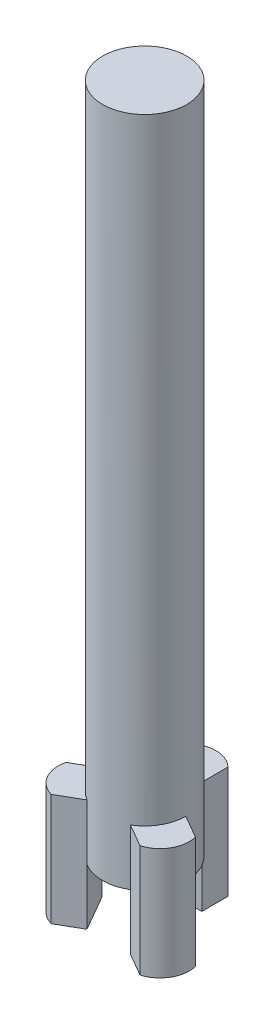
ISO-10303-21;
HEADER;
FILE_DESCRIPTION(('STEP AP214'),'2;1');
FILE_NAME('part.step','',(''),(''),'','','');
FILE_SCHEMA(('AUTOMOTIVE_DESIGN { 1 0 10303 214 1 1 1 1 }'));
ENDSEC;
DATA;
#1=APPLICATION_CONTEXT('core data for automotive mechanical design processes');
#2=APPLICATION_PROTOCOL_DEFINITION('international standard','automotive_design',2000,#1);
#3=PRODUCT_CONTEXT('',#1,'mechanical');
#4=PRODUCT('Part','Part','',(#3));
#5=PRODUCT_RELATED_PRODUCT_CATEGORY('part','',(#4));
#6=PRODUCT_DEFINITION_FORMATION('','',#4);
#7=PRODUCT_DEFINITION_CONTEXT('part definition',#1,'design');
#8=PRODUCT_DEFINITION('design','',#6,#7);
#9=PRODUCT_DEFINITION_SHAPE('','',#8);
#10=(LENGTH_UNIT() NAMED_UNIT(*) SI_UNIT(.MILLI.,.METRE.));
#11=(NAMED_UNIT(*) PLANE_ANGLE_UNIT() SI_UNIT($,.RADIAN.));
#12=(NAMED_UNIT(*) SI_UNIT($,.STERADIAN.) SOLID_ANGLE_UNIT());
#13=UNCERTAINTY_MEASURE_WITH_UNIT(LENGTH_MEASURE(1.E-05),#10,'distance_accuracy_value','');
#14=(GEOMETRIC_REPRESENTATION_CONTEXT(3) GLOBAL_UNCERTAINTY_ASSIGNED_CONTEXT((#13)) GLOBAL_UNIT_ASSIGNED_CONTEXT((#10,
#11,#12)) REPRESENTATION_CONTEXT('',''));
#15=CARTESIAN_POINT('',(0.,0.,0.));
#16=DIRECTION('',(0.,0.,1.));
#17=DIRECTION('',(1.,0.,0.));
#18=AXIS2_PLACEMENT_3D('',#15,#16,#17);
#19=CARTESIAN_POINT('',(0.,130.,0.));
#20=DIRECTION('',(0.,-1.,0.));
#21=DIRECTION('',(0.,0.,-1.));
#22=AXIS2_PLACEMENT_3D('',#19,#20,#21);
#23=CYLINDRICAL_SURFACE('',#22,7.5);
#24=CARTESIAN_POINT('',(0.,130.,0.));
#25=DIRECTION('',(0.,1.,0.));
#26=DIRECTION('',(0.,0.,1.));
#27=AXIS2_PLACEMENT_3D('',#24,#25,#26);
#28=CIRCLE('',#27,7.5);
#29=CARTESIAN_POINT('',(0.,130.,7.5));
#30=VERTEX_POINT('',#29);
#31=EDGE_CURVE('E243',#30,#30,#28,.T.);
#32=ORIENTED_EDGE('',*,*,#31,.F.);
#33=EDGE_LOOP('',(#32));
#34=FACE_BOUND('',#33,.T.);
#35=CARTESIAN_POINT('',(0.,20.,0.));
#36=DIRECTION('',(0.,1.,0.));
#37=DIRECTION('',(0.,0.,1.));
#38=AXIS2_PLACEMENT_3D('',#35,#36,#37);
#39=CIRCLE('',#38,7.5);
#40=CARTESIAN_POINT('',(3.87664123035197,20.,6.42040908129187));
#41=VERTEX_POINT('',#40);
#42=CARTESIAN_POINT('',(7.49855798226306,20.,0.147065246196892));
#43=VERTEX_POINT('',#42);
#44=EDGE_CURVE('E11',#41,#43,#39,.T.);
#45=ORIENTED_EDGE('',*,*,#44,.T.);
#46=DIRECTION('',(0.,-1.,0.));
#47=VECTOR('',#46,1.);
#48=CARTESIAN_POINT('',(7.49855798226306,20.,0.147065246196892));
#49=LINE('',#48,#47);
#50=CARTESIAN_POINT('',(7.49855798226306,10.,0.147065246196892));
#51=VERTEX_POINT('',#50);
#52=EDGE_CURVE('E175',#43,#51,#49,.T.);
#53=ORIENTED_EDGE('',*,*,#52,.T.);
#54=CARTESIAN_POINT('',(0.,10.,0.));
#55=DIRECTION('',(0.,1.,0.));
#56=DIRECTION('',(0.,0.,1.));
#57=AXIS2_PLACEMENT_3D('',#54,#55,#56);
#58=CIRCLE('',#57,7.5);
#59=CARTESIAN_POINT('',(3.62191675191115,10.,-6.56747432748887));
#60=VERTEX_POINT('',#59);
#61=EDGE_CURVE('E233',#51,#60,#58,.T.);
#62=ORIENTED_EDGE('',*,*,#61,.T.);
#63=DIRECTION('',(0.,-1.,0.));
#64=VECTOR('',#63,1.);
#65=CARTESIAN_POINT('',(3.62191675191115,20.,-6.56747432748887));
#66=LINE('',#65,#64);
#67=CARTESIAN_POINT('',(3.62191675191115,20.,-6.56747432748887));
#68=VERTEX_POINT('',#67);
#69=EDGE_CURVE('E238',#68,#60,#66,.T.);
#70=ORIENTED_EDGE('',*,*,#69,.F.);
#71=CARTESIAN_POINT('',(0.,20.,0.));
#72=DIRECTION('',(0.,1.,0.));
#73=DIRECTION('',(0.,0.,1.));
#74=AXIS2_PLACEMENT_3D('',#71,#72,#73);
#75=CIRCLE('',#74,7.5);
#76=CARTESIAN_POINT('',(-3.62191675191115,20.,-6.56747432748887));
#77=VERTEX_POINT('',#76);
#78=EDGE_CURVE('E253',#68,#77,#75,.T.);
#79=ORIENTED_EDGE('',*,*,#78,.T.);
#80=DIRECTION('',(0.,-1.,0.));
#81=VECTOR('',#80,1.);
#82=CARTESIAN_POINT('',(-3.62191675191115,20.,-6.56747432748887));
#83=LINE('',#82,#81);
#84=CARTESIAN_POINT('',(-3.62191675191115,10.,-6.56747432748887));
#85=VERTEX_POINT('',#84);
#86=EDGE_CURVE('E234',#77,#85,#83,.T.);
#87=ORIENTED_EDGE('',*,*,#86,.T.);
#88=CARTESIAN_POINT('',(-7.49855798226306,10.,0.147065246196996));
#89=VERTEX_POINT('',#88);
#90=EDGE_CURVE('E247',#85,#89,#58,.T.);
#91=ORIENTED_EDGE('',*,*,#90,.T.);
#92=DIRECTION('',(0.,-1.,0.));
#93=VECTOR('',#92,1.);
#94=CARTESIAN_POINT('',(-7.49855798226306,20.,0.147065246196998));
#95=LINE('',#94,#93);
#96=CARTESIAN_POINT('',(-7.49855798226306,20.,0.147065246196998));
#97=VERTEX_POINT('',#96);
#98=EDGE_CURVE('E55',#97,#89,#95,.T.);
#99=ORIENTED_EDGE('',*,*,#98,.F.);
#100=CARTESIAN_POINT('',(0.,20.,0.));
#101=DIRECTION('',(0.,1.,0.));
#102=DIRECTION('',(0.,0.,1.));
#103=AXIS2_PLACEMENT_3D('',#100,#101,#102);
#104=CIRCLE('',#103,7.5);
#105=CARTESIAN_POINT('',(-3.87664123035188,20.,6.42040908129193));
#106=VERTEX_POINT('',#105);
#107=EDGE_CURVE('E259',#97,#106,#104,.T.);
#108=ORIENTED_EDGE('',*,*,#107,.T.);
#109=DIRECTION('',(0.,-1.,0.));
#110=VECTOR('',#109,1.);
#111=CARTESIAN_POINT('',(-3.87664123035188,20.,6.42040908129193));
#112=LINE('',#111,#110);
#113=CARTESIAN_POINT('',(-3.87664123035188,10.,6.42040908129193));
#114=VERTEX_POINT('',#113);
#115=EDGE_CURVE('E203',#106,#114,#112,.T.);
#116=ORIENTED_EDGE('',*,*,#115,.T.);
#117=CARTESIAN_POINT('',(3.87664123035197,10.,6.42040908129187));
#118=VERTEX_POINT('',#117);
#119=EDGE_CURVE('E250',#114,#118,#58,.T.);
#120=ORIENTED_EDGE('',*,*,#119,.T.);
#121=DIRECTION('',(0.,-1.,0.));
#122=VECTOR('',#121,1.);
#123=CARTESIAN_POINT('',(3.87664123035197,20.,6.42040908129187));
#124=LINE('',#123,#122);
#125=EDGE_CURVE('E47',#41,#118,#124,.T.);
#126=ORIENTED_EDGE('',*,*,#125,.F.);
#127=EDGE_LOOP('',(#45,#53,#62,#70,#79,#87,#91,#99,#108,#116,#120,#126));
#128=FACE_BOUND('',#127,.T.);
#129=ADVANCED_FACE('F33',(#34,#128),#23,.T.);
#130=CARTESIAN_POINT('',(0.,130.,0.));
#131=DIRECTION('',(0.,1.,0.));
#132=DIRECTION('',(0.,0.,1.));
#133=AXIS2_PLACEMENT_3D('',#130,#131,#132);
#134=PLANE('',#133);
#135=ORIENTED_EDGE('',*,*,#31,.T.);
#136=EDGE_LOOP('',(#135));
#137=FACE_BOUND('',#136,.T.);
#138=ADVANCED_FACE('F306',(#137),#134,.T.);
#139=CARTESIAN_POINT('',(0.,10.,0.));
#140=DIRECTION('',(0.,1.,0.));
#141=DIRECTION('',(0.,0.,1.));
#142=AXIS2_PLACEMENT_3D('',#139,#140,#141);
#143=PLANE('',#142);
#144=ORIENTED_EDGE('',*,*,#61,.F.);
#145=DIRECTION('',(-0.499999999999992,0.,0.866025403784443));
#146=VECTOR('',#145,1.);
#147=CARTESIAN_POINT('',(5.68759960630752,10.,3.28373716374438));
#148=LINE('',#147,#146);
#149=EDGE_CURVE('E40',#51,#118,#148,.T.);
#150=ORIENTED_EDGE('',*,*,#149,.T.);
#151=ORIENTED_EDGE('',*,*,#119,.F.);
#152=DIRECTION('',(-0.500000000000004,0.,-0.866025403784436));
#153=VECTOR('',#152,1.);
#154=CARTESIAN_POINT('',(-5.68759960630747,10.,3.28373716374446));
#155=LINE('',#154,#153);
#156=EDGE_CURVE('E256',#114,#89,#155,.T.);
#157=ORIENTED_EDGE('',*,*,#156,.T.);
#158=ORIENTED_EDGE('',*,*,#90,.F.);
#159=DIRECTION('',(1.,0.,0.));
#160=VECTOR('',#159,1.);
#161=CARTESIAN_POINT('',(0.,10.,-6.56747432748887));
#162=LINE('',#161,#160);
#163=EDGE_CURVE('E246',#85,#60,#162,.T.);
#164=ORIENTED_EDGE('',*,*,#163,.T.);
#165=EDGE_LOOP('',(#144,#150,#151,#157,#158,#164));
#166=FACE_BOUND('',#165,.T.);
#167=ADVANCED_FACE('F266',(#166),#143,.F.);
#168=CARTESIAN_POINT('',(3.62191675191115,20.,-6.56747432748887));
#169=DIRECTION('',(0.,0.,1.));
#170=DIRECTION('',(1.,0.,0.));
#171=AXIS2_PLACEMENT_3D('',#168,#169,#170);
#172=PLANE('',#171);
#173=ORIENTED_EDGE('',*,*,#163,.F.);
#174=CARTESIAN_POINT('',(-3.62191675191115,0.,-6.56747432748887));
#175=VERTEX_POINT('',#174);
#176=EDGE_CURVE('E237',#85,#175,#83,.T.);
#177=ORIENTED_EDGE('',*,*,#176,.T.);
#178=DIRECTION('',(-1.,0.,0.));
#179=VECTOR('',#178,1.);
#180=CARTESIAN_POINT('',(3.62191675191115,0.,-6.56747432748887));
#181=LINE('',#180,#179);
#182=CARTESIAN_POINT('',(3.62191675191115,0.,-6.56747432748887));
#183=VERTEX_POINT('',#182);
#184=EDGE_CURVE('E226',#183,#175,#181,.T.);
#185=ORIENTED_EDGE('',*,*,#184,.F.);
#186=EDGE_CURVE('E241',#60,#183,#66,.T.);
#187=ORIENTED_EDGE('',*,*,#186,.F.);
#188=EDGE_LOOP('',(#173,#177,#185,#187));
#189=FACE_BOUND('',#188,.T.);
#190=ADVANCED_FACE('F278',(#189),#172,.T.);
#191=CARTESIAN_POINT('',(0.,20.,-7.5));
#192=DIRECTION('',(0.,-1.,0.));
#193=DIRECTION('',(0.,0.,-1.));
#194=AXIS2_PLACEMENT_3D('',#191,#192,#193);
#195=CYLINDRICAL_SURFACE('',#194,5.21351905700695);
#196=CARTESIAN_POINT('',(0.,0.,-7.5));
#197=DIRECTION('',(0.,-1.,0.));
#198=DIRECTION('',(0.,0.,1.));
#199=AXIS2_PLACEMENT_3D('',#196,#197,#198);
#200=CIRCLE('',#199,5.21351905700695);
#201=CARTESIAN_POINT('',(-3.62191675191115,0.,-11.25));
#202=VERTEX_POINT('',#201);
#203=CARTESIAN_POINT('',(3.62191675191115,0.,-11.25));
#204=VERTEX_POINT('',#203);
#205=EDGE_CURVE('E202',#202,#204,#200,.T.);
#206=ORIENTED_EDGE('',*,*,#205,.F.);
#207=DIRECTION('',(0.,-1.,0.));
#208=VECTOR('',#207,1.);
#209=CARTESIAN_POINT('',(-3.62191675191115,20.,-11.25));
#210=LINE('',#209,#208);
#211=CARTESIAN_POINT('',(-3.62191675191115,20.,-11.25));
#212=VERTEX_POINT('',#211);
#213=EDGE_CURVE('E231',#212,#202,#210,.T.);
#214=ORIENTED_EDGE('',*,*,#213,.F.);
#215=CARTESIAN_POINT('',(0.,20.,-7.5));
#216=DIRECTION('',(0.,-1.,0.));
#217=DIRECTION('',(0.,0.,1.));
#218=AXIS2_PLACEMENT_3D('',#215,#216,#217);
#219=CIRCLE('',#218,5.21351905700695);
#220=CARTESIAN_POINT('',(3.62191675191115,20.,-11.25));
#221=VERTEX_POINT('',#220);
#222=EDGE_CURVE('E210',#212,#221,#219,.T.);
#223=ORIENTED_EDGE('',*,*,#222,.T.);
#224=DIRECTION('',(0.,-1.,0.));
#225=VECTOR('',#224,1.);
#226=CARTESIAN_POINT('',(3.62191675191115,20.,-11.25));
#227=LINE('',#226,#225);
#228=EDGE_CURVE('E220',#221,#204,#227,.T.);
#229=ORIENTED_EDGE('',*,*,#228,.T.);
#230=EDGE_LOOP('',(#206,#214,#223,#229));
#231=FACE_BOUND('',#230,.T.);
#232=ADVANCED_FACE('F290',(#231),#195,.T.);
#233=CARTESIAN_POINT('',(-3.62191675191115,20.,-6.56747432748887));
#234=DIRECTION('',(-1.,0.,0.));
#235=DIRECTION('',(0.,0.,1.));
#236=AXIS2_PLACEMENT_3D('',#233,#234,#235);
#237=PLANE('',#236);
#238=DIRECTION('',(0.,0.,-1.));
#239=VECTOR('',#238,1.);
#240=CARTESIAN_POINT('',(-3.62191675191115,0.,-6.56747432748887));
#241=LINE('',#240,#239);
#242=EDGE_CURVE('E214',#175,#202,#241,.T.);
#243=ORIENTED_EDGE('',*,*,#242,.F.);
#244=ORIENTED_EDGE('',*,*,#176,.F.);
#245=ORIENTED_EDGE('',*,*,#86,.F.);
#246=DIRECTION('',(0.,0.,-1.));
#247=VECTOR('',#246,1.);
#248=CARTESIAN_POINT('',(-3.62191675191115,20.,-6.56747432748887));
#249=LINE('',#248,#247);
#250=EDGE_CURVE('E217',#77,#212,#249,.T.);
#251=ORIENTED_EDGE('',*,*,#250,.T.);
#252=ORIENTED_EDGE('',*,*,#213,.T.);
#253=EDGE_LOOP('',(#243,#244,#245,#251,#252));
#254=FACE_BOUND('',#253,.T.);
#255=ADVANCED_FACE('F284',(#254),#237,.T.);
#256=CARTESIAN_POINT('',(3.62191675191115,20.,-6.56747432748887));
#257=DIRECTION('',(1.,0.,0.));
#258=DIRECTION('',(0.,0.,-1.));
#259=AXIS2_PLACEMENT_3D('',#256,#257,#258);
#260=PLANE('',#259);
#261=DIRECTION('',(0.,0.,1.));
#262=VECTOR('',#261,1.);
#263=CARTESIAN_POINT('',(3.62191675191115,0.,-6.56747432748887));
#264=LINE('',#263,#262);
#265=EDGE_CURVE('E223',#204,#183,#264,.T.);
#266=ORIENTED_EDGE('',*,*,#265,.F.);
#267=ORIENTED_EDGE('',*,*,#228,.F.);
#268=DIRECTION('',(0.,0.,1.));
#269=VECTOR('',#268,1.);
#270=CARTESIAN_POINT('',(3.62191675191115,20.,-6.56747432748887));
#271=LINE('',#270,#269);
#272=EDGE_CURVE('E213',#221,#68,#271,.T.);
#273=ORIENTED_EDGE('',*,*,#272,.T.);
#274=ORIENTED_EDGE('',*,*,#69,.T.);
#275=ORIENTED_EDGE('',*,*,#186,.T.);
#276=EDGE_LOOP('',(#266,#267,#273,#274,#275));
#277=FACE_BOUND('',#276,.T.);
#278=ADVANCED_FACE('F274',(#277),#260,.T.);
#279=CARTESIAN_POINT('',(0.,20.,-7.5));
#280=DIRECTION('',(0.,1.,0.));
#281=DIRECTION('',(0.,0.,1.));
#282=AXIS2_PLACEMENT_3D('',#279,#280,#281);
#283=PLANE('',#282);
#284=ORIENTED_EDGE('',*,*,#78,.F.);
#285=ORIENTED_EDGE('',*,*,#272,.F.);
#286=ORIENTED_EDGE('',*,*,#222,.F.);
#287=ORIENTED_EDGE('',*,*,#250,.F.);
#288=EDGE_LOOP('',(#284,#285,#286,#287));
#289=FACE_BOUND('',#288,.T.);
#290=ADVANCED_FACE('F287',(#289),#283,.T.);
#291=CARTESIAN_POINT('',(0.,0.,-7.5));
#292=DIRECTION('',(0.,1.,0.));
#293=DIRECTION('',(0.,0.,1.));
#294=AXIS2_PLACEMENT_3D('',#291,#292,#293);
#295=PLANE('',#294);
#296=ORIENTED_EDGE('',*,*,#205,.T.);
#297=ORIENTED_EDGE('',*,*,#265,.T.);
#298=ORIENTED_EDGE('',*,*,#184,.T.);
#299=ORIENTED_EDGE('',*,*,#242,.T.);
#300=EDGE_LOOP('',(#296,#297,#298,#299));
#301=FACE_BOUND('',#300,.T.);
#302=ADVANCED_FACE('F292',(#301),#295,.F.);
#303=CARTESIAN_POINT('',(-7.49855798226306,20.,0.147065246196998));
#304=DIRECTION('',(0.866025403784436,0.,-0.500000000000004));
#305=DIRECTION('',(-0.500000000000004,0.,-0.866025403784436));
#306=AXIS2_PLACEMENT_3D('',#303,#304,#305);
#307=PLANE('',#306);
#308=ORIENTED_EDGE('',*,*,#156,.F.);
#309=CARTESIAN_POINT('',(-3.87664123035188,0.,6.42040908129193));
#310=VERTEX_POINT('',#309);
#311=EDGE_CURVE('E206',#114,#310,#112,.T.);
#312=ORIENTED_EDGE('',*,*,#311,.T.);
#313=DIRECTION('',(0.500000000000004,0.,0.866025403784436));
#314=VECTOR('',#313,1.);
#315=CARTESIAN_POINT('',(-7.49855798226306,0.,0.147065246196998));
#316=LINE('',#315,#314);
#317=CARTESIAN_POINT('',(-7.49855798226306,0.,0.147065246196998));
#318=VERTEX_POINT('',#317);
#319=EDGE_CURVE('E195',#318,#310,#316,.T.);
#320=ORIENTED_EDGE('',*,*,#319,.F.);
#321=EDGE_CURVE('E208',#89,#318,#95,.T.);
#322=ORIENTED_EDGE('',*,*,#321,.F.);
#323=EDGE_LOOP('',(#308,#312,#320,#322));
#324=FACE_BOUND('',#323,.T.);
#325=ADVANCED_FACE('F294',(#324),#307,.T.);
#326=CARTESIAN_POINT('',(-6.49519052838327,20.,3.75000000000003));
#327=DIRECTION('',(0.,-1.,0.));
#328=DIRECTION('',(0.,0.,-1.));
#329=AXIS2_PLACEMENT_3D('',#326,#327,#328);
#330=CYLINDRICAL_SURFACE('',#329,5.21351905700695);
#331=CARTESIAN_POINT('',(-6.49519052838327,0.,3.75000000000003));
#332=DIRECTION('',(0.,-1.,0.));
#333=DIRECTION('',(0.866025403784436,0.,-0.500000000000004));
#334=AXIS2_PLACEMENT_3D('',#331,#332,#333);
#335=CIRCLE('',#334,5.21351905700695);
#336=CARTESIAN_POINT('',(-7.93182741661932,0.,8.76167191754751));
#337=VERTEX_POINT('',#336);
#338=CARTESIAN_POINT('',(-11.5537441685305,0.,2.48832808245258));
#339=VERTEX_POINT('',#338);
#340=EDGE_CURVE('E174',#337,#339,#335,.T.);
#341=ORIENTED_EDGE('',*,*,#340,.F.);
#342=DIRECTION('',(0.,-1.,0.));
#343=VECTOR('',#342,1.);
#344=CARTESIAN_POINT('',(-7.93182741661932,20.,8.76167191754751));
#345=LINE('',#344,#343);
#346=CARTESIAN_POINT('',(-7.93182741661932,20.,8.76167191754751));
#347=VERTEX_POINT('',#346);
#348=EDGE_CURVE('E200',#347,#337,#345,.T.);
#349=ORIENTED_EDGE('',*,*,#348,.F.);
#350=CARTESIAN_POINT('',(-6.49519052838327,20.,3.75000000000003));
#351=DIRECTION('',(0.,-1.,0.));
#352=DIRECTION('',(0.866025403784436,0.,-0.500000000000004));
#353=AXIS2_PLACEMENT_3D('',#350,#351,#352);
#354=CIRCLE('',#353,5.21351905700695);
#355=CARTESIAN_POINT('',(-11.5537441685305,20.,2.48832808245258));
#356=VERTEX_POINT('',#355);
#357=EDGE_CURVE('E180',#347,#356,#354,.T.);
#358=ORIENTED_EDGE('',*,*,#357,.T.);
#359=DIRECTION('',(0.,-1.,0.));
#360=VECTOR('',#359,1.);
#361=CARTESIAN_POINT('',(-11.5537441685305,20.,2.48832808245258));
#362=LINE('',#361,#360);
#363=EDGE_CURVE('E189',#356,#339,#362,.T.);
#364=ORIENTED_EDGE('',*,*,#363,.T.);
#365=EDGE_LOOP('',(#341,#349,#358,#364));
#366=FACE_BOUND('',#365,.T.);
#367=ADVANCED_FACE('F300',(#366),#330,.T.);
#368=CARTESIAN_POINT('',(-3.87664123035188,20.,6.42040908129193));
#369=DIRECTION('',(0.500000000000004,0.,0.866025403784436));
#370=DIRECTION('',(0.866025403784436,0.,-0.500000000000004));
#371=AXIS2_PLACEMENT_3D('',#368,#369,#370);
#372=PLANE('',#371);
#373=DIRECTION('',(-0.866025403784437,0.,0.500000000000004));
#374=VECTOR('',#373,1.);
#375=CARTESIAN_POINT('',(-3.87664123035188,0.,6.42040908129193));
#376=LINE('',#375,#374);
#377=EDGE_CURVE('E184',#310,#337,#376,.T.);
#378=ORIENTED_EDGE('',*,*,#377,.F.);
#379=ORIENTED_EDGE('',*,*,#311,.F.);
#380=ORIENTED_EDGE('',*,*,#115,.F.);
#381=DIRECTION('',(-0.866025403784437,0.,0.500000000000004));
#382=VECTOR('',#381,1.);
#383=CARTESIAN_POINT('',(-3.87664123035188,20.,6.42040908129193));
#384=LINE('',#383,#382);
#385=EDGE_CURVE('E186',#106,#347,#384,.T.);
#386=ORIENTED_EDGE('',*,*,#385,.T.);
#387=ORIENTED_EDGE('',*,*,#348,.T.);
#388=EDGE_LOOP('',(#378,#379,#380,#386,#387));
#389=FACE_BOUND('',#388,.T.);
#390=ADVANCED_FACE('F367',(#389),#372,.T.);
#391=CARTESIAN_POINT('',(-7.49855798226306,20.,0.147065246196998));
#392=DIRECTION('',(-0.500000000000004,0.,-0.866025403784436));
#393=DIRECTION('',(-0.866025403784436,0.,0.500000000000004));
#394=AXIS2_PLACEMENT_3D('',#391,#392,#393);
#395=PLANE('',#394);
#396=DIRECTION('',(0.866025403784436,0.,-0.500000000000004));
#397=VECTOR('',#396,1.);
#398=CARTESIAN_POINT('',(-7.49855798226306,0.,0.147065246196998));
#399=LINE('',#398,#397);
#400=EDGE_CURVE('E192',#339,#318,#399,.T.);
#401=ORIENTED_EDGE('',*,*,#400,.F.);
#402=ORIENTED_EDGE('',*,*,#363,.F.);
#403=DIRECTION('',(0.866025403784436,0.,-0.500000000000004));
#404=VECTOR('',#403,1.);
#405=CARTESIAN_POINT('',(-7.49855798226306,20.,0.147065246196998));
#406=LINE('',#405,#404);
#407=EDGE_CURVE('E183',#356,#97,#406,.T.);
#408=ORIENTED_EDGE('',*,*,#407,.T.);
#409=ORIENTED_EDGE('',*,*,#98,.T.);
#410=ORIENTED_EDGE('',*,*,#321,.T.);
#411=EDGE_LOOP('',(#401,#402,#408,#409,#410));
#412=FACE_BOUND('',#411,.T.);
#413=ADVANCED_FACE('F377',(#412),#395,.T.);
#414=CARTESIAN_POINT('',(-6.49519052838327,20.,3.75000000000003));
#415=DIRECTION('',(0.,1.,0.));
#416=DIRECTION('',(0.866025403784436,0.,-0.500000000000004));
#417=AXIS2_PLACEMENT_3D('',#414,#415,#416);
#418=PLANE('',#417);
#419=ORIENTED_EDGE('',*,*,#107,.F.);
#420=ORIENTED_EDGE('',*,*,#407,.F.);
#421=ORIENTED_EDGE('',*,*,#357,.F.);
#422=ORIENTED_EDGE('',*,*,#385,.F.);
#423=EDGE_LOOP('',(#419,#420,#421,#422));
#424=FACE_BOUND('',#423,.T.);
#425=ADVANCED_FACE('F387',(#424),#418,.T.);
#426=CARTESIAN_POINT('',(-6.49519052838327,0.,3.75000000000003));
#427=DIRECTION('',(0.,1.,0.));
#428=DIRECTION('',(0.866025403784436,0.,-0.500000000000004));
#429=AXIS2_PLACEMENT_3D('',#426,#427,#428);
#430=PLANE('',#429);
#431=ORIENTED_EDGE('',*,*,#340,.T.);
#432=ORIENTED_EDGE('',*,*,#400,.T.);
#433=ORIENTED_EDGE('',*,*,#319,.T.);
#434=ORIENTED_EDGE('',*,*,#377,.T.);
#435=EDGE_LOOP('',(#431,#432,#433,#434));
#436=FACE_BOUND('',#435,.T.);
#437=ADVANCED_FACE('F396',(#436),#430,.F.);
#438=CARTESIAN_POINT('',(3.87664123035197,20.,6.42040908129187));
#439=DIRECTION('',(-0.866025403784443,0.,-0.499999999999992));
#440=DIRECTION('',(-0.499999999999992,0.,0.866025403784443));
#441=AXIS2_PLACEMENT_3D('',#438,#439,#440);
#442=PLANE('',#441);
#443=ORIENTED_EDGE('',*,*,#149,.F.);
#444=CARTESIAN_POINT('',(7.49855798226306,0.,0.147065246196892));
#445=VERTEX_POINT('',#444);
#446=EDGE_CURVE('E178',#51,#445,#49,.T.);
#447=ORIENTED_EDGE('',*,*,#446,.T.);
#448=DIRECTION('',(0.499999999999992,0.,-0.866025403784443));
#449=VECTOR('',#448,1.);
#450=CARTESIAN_POINT('',(3.87664123035197,0.,6.42040908129187));
#451=LINE('',#450,#449);
#452=CARTESIAN_POINT('',(3.87664123035197,0.,6.42040908129187));
#453=VERTEX_POINT('',#452);
#454=EDGE_CURVE('E164',#453,#445,#451,.T.);
#455=ORIENTED_EDGE('',*,*,#454,.F.);
#456=EDGE_CURVE('E149',#118,#453,#124,.T.);
#457=ORIENTED_EDGE('',*,*,#456,.F.);
#458=EDGE_LOOP('',(#443,#447,#455,#457));
#459=FACE_BOUND('',#458,.T.);
#460=ADVANCED_FACE('F406',(#459),#442,.T.);
#461=CARTESIAN_POINT('',(6.49519052838332,20.,3.74999999999994));
#462=DIRECTION('',(0.,-1.,0.));
#463=DIRECTION('',(0.,0.,-1.));
#464=AXIS2_PLACEMENT_3D('',#461,#462,#463);
#465=CYLINDRICAL_SURFACE('',#464,5.21351905700695);
#466=CARTESIAN_POINT('',(6.49519052838332,0.,3.74999999999994));
#467=DIRECTION('',(0.,-1.,0.));
#468=DIRECTION('',(-0.866025403784443,0.,-0.499999999999992));
#469=AXIS2_PLACEMENT_3D('',#466,#467,#468);
#470=CIRCLE('',#469,5.21351905700695);
#471=CARTESIAN_POINT('',(11.5537441685305,0.,2.48832808245242));
#472=VERTEX_POINT('',#471);
#473=CARTESIAN_POINT('',(7.93182741661944,0.,8.7616719175474));
#474=VERTEX_POINT('',#473);
#475=EDGE_CURVE('E168',#472,#474,#470,.T.);
#476=ORIENTED_EDGE('',*,*,#475,.F.);
#477=DIRECTION('',(0.,-1.,0.));
#478=VECTOR('',#477,1.);
#479=CARTESIAN_POINT('',(11.5537441685305,20.,2.48832808245242));
#480=LINE('',#479,#478);
#481=CARTESIAN_POINT('',(11.5537441685305,20.,2.48832808245242));
#482=VERTEX_POINT('',#481);
#483=EDGE_CURVE('E160',#482,#472,#480,.T.);
#484=ORIENTED_EDGE('',*,*,#483,.F.);
#485=CARTESIAN_POINT('',(6.49519052838332,20.,3.74999999999994));
#486=DIRECTION('',(0.,-1.,0.));
#487=DIRECTION('',(-0.866025403784443,0.,-0.499999999999992));
#488=AXIS2_PLACEMENT_3D('',#485,#486,#487);
#489=CIRCLE('',#488,5.21351905700695);
#490=CARTESIAN_POINT('',(7.93182741661944,20.,8.7616719175474));
#491=VERTEX_POINT('',#490);
#492=EDGE_CURVE('E156',#482,#491,#489,.T.);
#493=ORIENTED_EDGE('',*,*,#492,.T.);
#494=DIRECTION('',(0.,-1.,0.));
#495=VECTOR('',#494,1.);
#496=CARTESIAN_POINT('',(7.93182741661944,20.,8.7616719175474));
#497=LINE('',#496,#495);
#498=EDGE_CURVE('E139',#491,#474,#497,.T.);
#499=ORIENTED_EDGE('',*,*,#498,.T.);
#500=EDGE_LOOP('',(#476,#484,#493,#499));
#501=FACE_BOUND('',#500,.T.);
#502=ADVANCED_FACE('F159',(#501),#465,.T.);
#503=CARTESIAN_POINT('',(7.49855798226306,20.,0.147065246196892));
#504=DIRECTION('',(0.499999999999992,0.,-0.866025403784443));
#505=DIRECTION('',(-0.866025403784443,0.,-0.499999999999992));
#506=AXIS2_PLACEMENT_3D('',#503,#504,#505);
#507=PLANE('',#506);
#508=DIRECTION('',(0.866025403784443,0.,0.499999999999992));
#509=VECTOR('',#508,1.);
#510=CARTESIAN_POINT('',(7.49855798226306,0.,0.147065246196892));
#511=LINE('',#510,#509);
#512=EDGE_CURVE('E161',#445,#472,#511,.T.);
#513=ORIENTED_EDGE('',*,*,#512,.F.);
#514=ORIENTED_EDGE('',*,*,#446,.F.);
#515=ORIENTED_EDGE('',*,*,#52,.F.);
#516=DIRECTION('',(0.866025403784443,0.,0.499999999999992));
#517=VECTOR('',#516,1.);
#518=CARTESIAN_POINT('',(7.49855798226306,20.,0.147065246196892));
#519=LINE('',#518,#517);
#520=EDGE_CURVE('E150',#43,#482,#519,.T.);
#521=ORIENTED_EDGE('',*,*,#520,.T.);
#522=ORIENTED_EDGE('',*,*,#483,.T.);
#523=EDGE_LOOP('',(#513,#514,#515,#521,#522));
#524=FACE_BOUND('',#523,.T.);
#525=ADVANCED_FACE('F424',(#524),#507,.T.);
#526=CARTESIAN_POINT('',(3.87664123035197,20.,6.42040908129187));
#527=DIRECTION('',(-0.499999999999992,0.,0.866025403784443));
#528=DIRECTION('',(0.866025403784443,0.,0.499999999999992));
#529=AXIS2_PLACEMENT_3D('',#526,#527,#528);
#530=PLANE('',#529);
#531=DIRECTION('',(-0.866025403784443,0.,-0.499999999999992));
#532=VECTOR('',#531,1.);
#533=CARTESIAN_POINT('',(3.87664123035197,0.,6.42040908129187));
#534=LINE('',#533,#532);
#535=EDGE_CURVE('E144',#474,#453,#534,.T.);
#536=ORIENTED_EDGE('',*,*,#535,.F.);
#537=ORIENTED_EDGE('',*,*,#498,.F.);
#538=DIRECTION('',(-0.866025403784443,0.,-0.499999999999992));
#539=VECTOR('',#538,1.);
#540=CARTESIAN_POINT('',(3.87664123035197,20.,6.42040908129187));
#541=LINE('',#540,#539);
#542=EDGE_CURVE('E142',#491,#41,#541,.T.);
#543=ORIENTED_EDGE('',*,*,#542,.T.);
#544=ORIENTED_EDGE('',*,*,#125,.T.);
#545=ORIENTED_EDGE('',*,*,#456,.T.);
#546=EDGE_LOOP('',(#536,#537,#543,#544,#545));
#547=FACE_BOUND('',#546,.T.);
#548=ADVANCED_FACE('F141',(#547),#530,.T.);
#549=CARTESIAN_POINT('',(6.49519052838332,20.,3.74999999999994));
#550=DIRECTION('',(0.,1.,0.));
#551=DIRECTION('',(-0.866025403784443,0.,-0.499999999999992));
#552=AXIS2_PLACEMENT_3D('',#549,#550,#551);
#553=PLANE('',#552);
#554=ORIENTED_EDGE('',*,*,#44,.F.);
#555=ORIENTED_EDGE('',*,*,#542,.F.);
#556=ORIENTED_EDGE('',*,*,#492,.F.);
#557=ORIENTED_EDGE('',*,*,#520,.F.);
#558=EDGE_LOOP('',(#554,#555,#556,#557));
#559=FACE_BOUND('',#558,.T.);
#560=ADVANCED_FACE('F154',(#559),#553,.T.);
#561=CARTESIAN_POINT('',(6.49519052838332,0.,3.74999999999994));
#562=DIRECTION('',(0.,1.,0.));
#563=DIRECTION('',(-0.866025403784443,0.,-0.499999999999992));
#564=AXIS2_PLACEMENT_3D('',#561,#562,#563);
#565=PLANE('',#564);
#566=ORIENTED_EDGE('',*,*,#475,.T.);
#567=ORIENTED_EDGE('',*,*,#535,.T.);
#568=ORIENTED_EDGE('',*,*,#454,.T.);
#569=ORIENTED_EDGE('',*,*,#512,.T.);
#570=EDGE_LOOP('',(#566,#567,#568,#569));
#571=FACE_BOUND('',#570,.T.);
#572=ADVANCED_FACE('F450',(#571),#565,.F.);
#573=CLOSED_SHELL('',(#129,#138,#167,#190,#232,#255,#278,#290,#302,#325,#367,#390,#413,#425,
#437,#460,#502,#525,#548,#560,#572));
#574=MANIFOLD_SOLID_BREP('B2',#573);
#575=ADVANCED_BREP_SHAPE_REPRESENTATION('',(#18,#574),#14);
#576=SHAPE_DEFINITION_REPRESENTATION(#9,#575);
ENDSEC;
END-ISO-10303-21;
